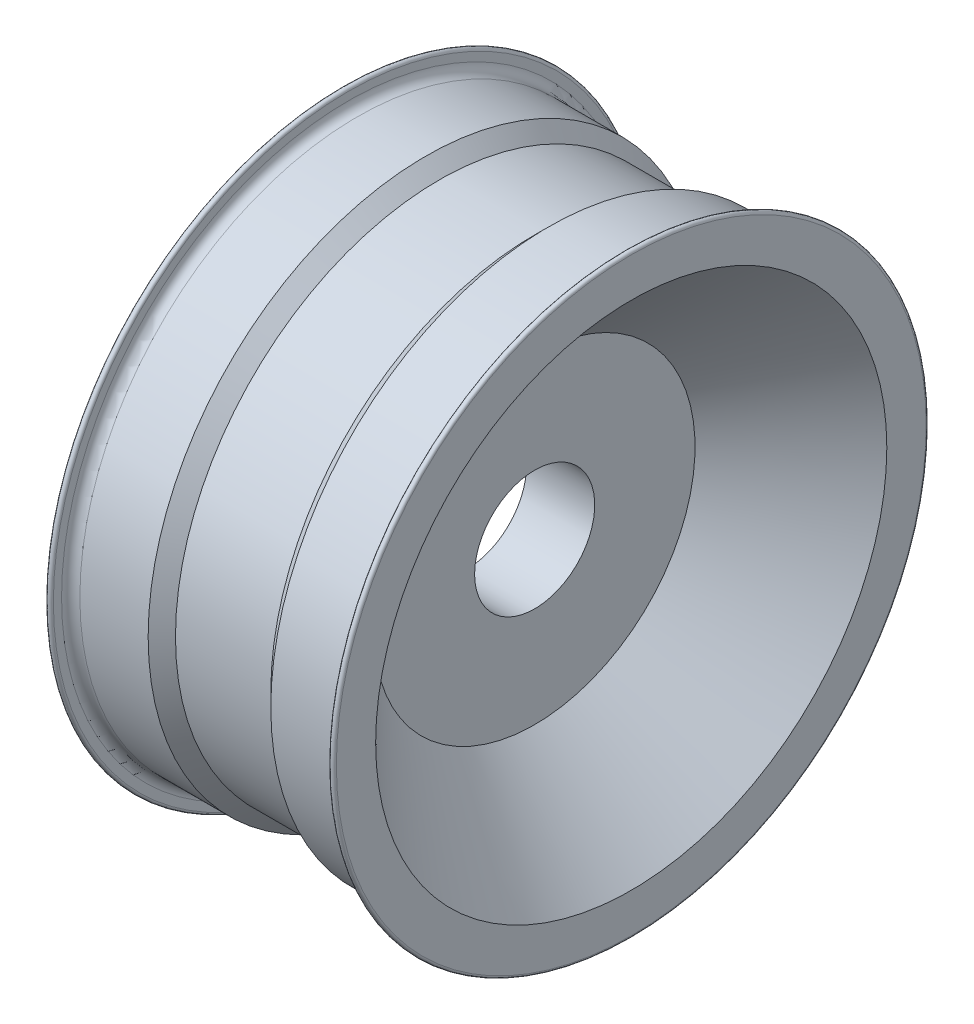
ISO-10303-21;
HEADER;
FILE_DESCRIPTION(('STEP AP214'),'2;1');
FILE_NAME('part.step','',(''),(''),'','','');
FILE_SCHEMA(('AUTOMOTIVE_DESIGN { 1 0 10303 214 1 1 1 1 }'));
ENDSEC;
DATA;
#1=APPLICATION_CONTEXT('core data for automotive mechanical design processes');
#2=APPLICATION_PROTOCOL_DEFINITION('international standard','automotive_design',2000,#1);
#3=PRODUCT_CONTEXT('',#1,'mechanical');
#4=PRODUCT('Part','Part','',(#3));
#5=PRODUCT_RELATED_PRODUCT_CATEGORY('part','',(#4));
#6=PRODUCT_DEFINITION_FORMATION('','',#4);
#7=PRODUCT_DEFINITION_CONTEXT('part definition',#1,'design');
#8=PRODUCT_DEFINITION('design','',#6,#7);
#9=PRODUCT_DEFINITION_SHAPE('','',#8);
#10=(LENGTH_UNIT() NAMED_UNIT(*) SI_UNIT(.MILLI.,.METRE.));
#11=(NAMED_UNIT(*) PLANE_ANGLE_UNIT() SI_UNIT($,.RADIAN.));
#12=(NAMED_UNIT(*) SI_UNIT($,.STERADIAN.) SOLID_ANGLE_UNIT());
#13=UNCERTAINTY_MEASURE_WITH_UNIT(LENGTH_MEASURE(1.E-05),#10,'distance_accuracy_value','');
#14=(GEOMETRIC_REPRESENTATION_CONTEXT(3) GLOBAL_UNCERTAINTY_ASSIGNED_CONTEXT((#13)) GLOBAL_UNIT_ASSIGNED_CONTEXT((#10,
#11,#12)) REPRESENTATION_CONTEXT('',''));
#15=CARTESIAN_POINT('',(0.,0.,0.));
#16=DIRECTION('',(0.,0.,1.));
#17=DIRECTION('',(1.,0.,0.));
#18=AXIS2_PLACEMENT_3D('',#15,#16,#17);
#19=CARTESIAN_POINT('',(0.,0.,0.));
#20=DIRECTION('',(-1.,0.,0.));
#21=DIRECTION('',(0.,0.,1.));
#22=AXIS2_PLACEMENT_3D('',#19,#20,#21);
#23=CYLINDRICAL_SURFACE('',#22,203.2);
#24=CARTESIAN_POINT('',(-94.9,0.,0.));
#25=DIRECTION('',(-1.,0.,0.));
#26=DIRECTION('',(0.,0.,1.));
#27=AXIS2_PLACEMENT_3D('',#24,#25,#26);
#28=CIRCLE('',#27,203.2);
#29=CARTESIAN_POINT('',(-94.9,0.,203.2));
#30=VERTEX_POINT('',#29);
#31=EDGE_CURVE('E11',#30,#30,#28,.T.);
#32=ORIENTED_EDGE('',*,*,#31,.F.);
#33=EDGE_LOOP('',(#32));
#34=FACE_BOUND('',#33,.T.);
#35=CARTESIAN_POINT('',(-44.9,0.,0.));
#36=DIRECTION('',(-1.,0.,0.));
#37=DIRECTION('',(0.,0.,1.));
#38=AXIS2_PLACEMENT_3D('',#35,#36,#37);
#39=CIRCLE('',#38,203.2);
#40=CARTESIAN_POINT('',(-44.9,0.,203.2));
#41=VERTEX_POINT('',#40);
#42=EDGE_CURVE('E91',#41,#41,#39,.T.);
#43=ORIENTED_EDGE('',*,*,#42,.T.);
#44=EDGE_LOOP('',(#43));
#45=FACE_BOUND('',#44,.T.);
#46=ADVANCED_FACE('F39',(#34,#45),#23,.T.);
#47=CARTESIAN_POINT('',(-94.9,0.,0.));
#48=DIRECTION('',(-1.,0.,0.));
#49=DIRECTION('',(0.,0.,1.));
#50=AXIS2_PLACEMENT_3D('',#47,#48,#49);
#51=TOROIDAL_SURFACE('',#50,209.9,6.7);
#52=CARTESIAN_POINT('',(-101.6,0.,0.));
#53=DIRECTION('',(-1.,0.,0.));
#54=DIRECTION('',(0.,0.,1.));
#55=AXIS2_PLACEMENT_3D('',#52,#53,#54);
#56=CIRCLE('',#55,209.9);
#57=CARTESIAN_POINT('',(-101.6,0.,209.9));
#58=VERTEX_POINT('',#57);
#59=EDGE_CURVE('E46',#58,#58,#56,.T.);
#60=ORIENTED_EDGE('',*,*,#59,.F.);
#61=EDGE_LOOP('',(#60));
#62=FACE_BOUND('',#61,.T.);
#63=ORIENTED_EDGE('',*,*,#31,.T.);
#64=EDGE_LOOP('',(#63));
#65=FACE_BOUND('',#64,.T.);
#66=ADVANCED_FACE('F122',(#62,#65),#51,.F.);
#67=CARTESIAN_POINT('',(-101.6,0.,0.));
#68=DIRECTION('',(-1.,0.,0.));
#69=DIRECTION('',(0.,0.,1.));
#70=AXIS2_PLACEMENT_3D('',#67,#68,#69);
#71=PLANE('',#70);
#72=CARTESIAN_POINT('',(-101.6,0.,0.));
#73=DIRECTION('',(-1.,0.,0.));
#74=DIRECTION('',(0.,0.,1.));
#75=AXIS2_PLACEMENT_3D('',#72,#73,#74);
#76=CIRCLE('',#75,215.9);
#77=CARTESIAN_POINT('',(-101.6,0.,215.9));
#78=VERTEX_POINT('',#77);
#79=EDGE_CURVE('E50',#78,#78,#76,.T.);
#80=ORIENTED_EDGE('',*,*,#79,.F.);
#81=EDGE_LOOP('',(#80));
#82=FACE_BOUND('',#81,.T.);
#83=ORIENTED_EDGE('',*,*,#59,.T.);
#84=EDGE_LOOP('',(#83));
#85=FACE_BOUND('',#84,.T.);
#86=ADVANCED_FACE('F127',(#82,#85),#71,.F.);
#87=CARTESIAN_POINT('',(-103.6,0.,0.));
#88=DIRECTION('',(-1.,0.,0.));
#89=DIRECTION('',(0.,0.,1.));
#90=AXIS2_PLACEMENT_3D('',#87,#88,#89);
#91=TOROIDAL_SURFACE('',#90,215.9,1.99999999999999);
#92=ORIENTED_EDGE('',*,*,#79,.T.);
#93=EDGE_LOOP('',(#92));
#94=FACE_BOUND('',#93,.T.);
#95=CARTESIAN_POINT('',(-105.6,0.,0.));
#96=DIRECTION('',(-1.,0.,0.));
#97=DIRECTION('',(0.,0.,1.));
#98=AXIS2_PLACEMENT_3D('',#95,#96,#97);
#99=CIRCLE('',#98,215.9);
#100=CARTESIAN_POINT('',(-105.6,0.,215.9));
#101=VERTEX_POINT('',#100);
#102=EDGE_CURVE('E55',#101,#101,#99,.T.);
#103=ORIENTED_EDGE('',*,*,#102,.F.);
#104=EDGE_LOOP('',(#103));
#105=FACE_BOUND('',#104,.T.);
#106=ADVANCED_FACE('F198',(#94,#105),#91,.T.);
#107=CARTESIAN_POINT('',(-105.6,0.,0.));
#108=DIRECTION('',(-1.,0.,0.));
#109=DIRECTION('',(0.,0.,1.));
#110=AXIS2_PLACEMENT_3D('',#107,#108,#109);
#111=PLANE('',#110);
#112=ORIENTED_EDGE('',*,*,#102,.T.);
#113=EDGE_LOOP('',(#112));
#114=FACE_BOUND('',#113,.T.);
#115=CARTESIAN_POINT('',(-105.6,0.,0.));
#116=DIRECTION('',(-1.,0.,0.));
#117=DIRECTION('',(0.,0.,1.));
#118=AXIS2_PLACEMENT_3D('',#115,#116,#117);
#119=CIRCLE('',#118,188.494969012571);
#120=CARTESIAN_POINT('',(-105.6,0.,188.494969012571));
#121=VERTEX_POINT('',#120);
#122=EDGE_CURVE('E58',#121,#121,#119,.T.);
#123=ORIENTED_EDGE('',*,*,#122,.F.);
#124=EDGE_LOOP('',(#123));
#125=FACE_BOUND('',#124,.T.);
#126=ADVANCED_FACE('F194',(#114,#125),#111,.T.);
#127=CARTESIAN_POINT('',(0.,0.,0.));
#128=DIRECTION('',(-1.,0.,0.));
#129=DIRECTION('',(0.,0.,1.));
#130=AXIS2_PLACEMENT_3D('',#127,#128,#129);
#131=CONICAL_SURFACE('',#130,117.431960932421,0.59233666114381);
#132=ORIENTED_EDGE('',*,*,#122,.T.);
#133=EDGE_LOOP('',(#132));
#134=FACE_BOUND('',#133,.T.);
#135=CARTESIAN_POINT('',(0.,0.,0.));
#136=DIRECTION('',(-1.,0.,0.));
#137=DIRECTION('',(0.,0.,1.));
#138=AXIS2_PLACEMENT_3D('',#135,#136,#137);
#139=CIRCLE('',#138,117.431960932421);
#140=CARTESIAN_POINT('',(0.,0.,117.431960932421));
#141=VERTEX_POINT('',#140);
#142=EDGE_CURVE('E61',#141,#141,#139,.T.);
#143=ORIENTED_EDGE('',*,*,#142,.F.);
#144=EDGE_LOOP('',(#143));
#145=FACE_BOUND('',#144,.T.);
#146=ADVANCED_FACE('F190',(#134,#145),#131,.F.);
#147=CARTESIAN_POINT('',(0.,0.,0.));
#148=DIRECTION('',(-1.,0.,0.));
#149=DIRECTION('',(0.,0.,1.));
#150=AXIS2_PLACEMENT_3D('',#147,#148,#149);
#151=PLANE('',#150);
#152=CARTESIAN_POINT('',(0.,0.,0.));
#153=DIRECTION('',(-1.,0.,0.));
#154=DIRECTION('',(0.,0.,1.));
#155=AXIS2_PLACEMENT_3D('',#152,#153,#154);
#156=CIRCLE('',#155,60.);
#157=CARTESIAN_POINT('',(0.,0.,60.));
#158=VERTEX_POINT('',#157);
#159=EDGE_CURVE('E95',#158,#158,#156,.T.);
#160=ORIENTED_EDGE('',*,*,#159,.F.);
#161=EDGE_LOOP('',(#160));
#162=FACE_BOUND('',#161,.T.);
#163=ORIENTED_EDGE('',*,*,#142,.T.);
#164=EDGE_LOOP('',(#163));
#165=FACE_BOUND('',#164,.T.);
#166=ADVANCED_FACE('F187',(#162,#165),#151,.T.);
#167=CARTESIAN_POINT('',(34.9,0.,0.));
#168=DIRECTION('',(-1.,0.,0.));
#169=DIRECTION('',(0.,0.,1.));
#170=AXIS2_PLACEMENT_3D('',#167,#168,#169);
#171=PLANE('',#170);
#172=CARTESIAN_POINT('',(34.9,0.,0.));
#173=DIRECTION('',(-1.,0.,0.));
#174=DIRECTION('',(0.,0.,1.));
#175=AXIS2_PLACEMENT_3D('',#172,#173,#174);
#176=CIRCLE('',#175,43.9792616711066);
#177=CARTESIAN_POINT('',(34.9,0.,43.9792616711066));
#178=VERTEX_POINT('',#177);
#179=EDGE_CURVE('E42',#178,#178,#176,.T.);
#180=ORIENTED_EDGE('',*,*,#179,.T.);
#181=EDGE_LOOP('',(#180));
#182=FACE_BOUND('',#181,.T.);
#183=CARTESIAN_POINT('',(34.9,0.,0.));
#184=DIRECTION('',(-1.,0.,0.));
#185=DIRECTION('',(0.,0.,1.));
#186=AXIS2_PLACEMENT_3D('',#183,#184,#185);
#187=CIRCLE('',#186,117.431960932421);
#188=CARTESIAN_POINT('',(34.9,0.,117.431960932421));
#189=VERTEX_POINT('',#188);
#190=EDGE_CURVE('E64',#189,#189,#187,.T.);
#191=ORIENTED_EDGE('',*,*,#190,.F.);
#192=EDGE_LOOP('',(#191));
#193=FACE_BOUND('',#192,.T.);
#194=ADVANCED_FACE('F107',(#182,#193),#171,.F.);
#195=CARTESIAN_POINT('',(34.9,0.,0.));
#196=DIRECTION('',(1.,0.,0.));
#197=DIRECTION('',(0.,0.,-1.));
#198=AXIS2_PLACEMENT_3D('',#195,#196,#197);
#199=CONICAL_SURFACE('',#198,117.431960932421,0.778280086177294);
#200=CARTESIAN_POINT('',(105.6,0.,0.));
#201=DIRECTION('',(-1.,0.,0.));
#202=DIRECTION('',(0.,0.,1.));
#203=AXIS2_PLACEMENT_3D('',#200,#201,#202);
#204=CIRCLE('',#203,187.132561735233);
#205=CARTESIAN_POINT('',(105.6,0.,187.132561735233));
#206=VERTEX_POINT('',#205);
#207=EDGE_CURVE('E67',#206,#206,#204,.T.);
#208=ORIENTED_EDGE('',*,*,#207,.F.);
#209=EDGE_LOOP('',(#208));
#210=FACE_BOUND('',#209,.T.);
#211=ORIENTED_EDGE('',*,*,#190,.T.);
#212=EDGE_LOOP('',(#211));
#213=FACE_BOUND('',#212,.T.);
#214=ADVANCED_FACE('F176',(#210,#213),#199,.F.);
#215=CARTESIAN_POINT('',(105.6,0.,0.));
#216=DIRECTION('',(1.,0.,0.));
#217=DIRECTION('',(0.,0.,-1.));
#218=AXIS2_PLACEMENT_3D('',#215,#216,#217);
#219=PLANE('',#218);
#220=ORIENTED_EDGE('',*,*,#207,.T.);
#221=EDGE_LOOP('',(#220));
#222=FACE_BOUND('',#221,.T.);
#223=CARTESIAN_POINT('',(105.6,0.,0.));
#224=DIRECTION('',(-1.,0.,0.));
#225=DIRECTION('',(0.,0.,1.));
#226=AXIS2_PLACEMENT_3D('',#223,#224,#225);
#227=CIRCLE('',#226,215.9);
#228=CARTESIAN_POINT('',(105.6,0.,215.9));
#229=VERTEX_POINT('',#228);
#230=EDGE_CURVE('E70',#229,#229,#227,.T.);
#231=ORIENTED_EDGE('',*,*,#230,.F.);
#232=EDGE_LOOP('',(#231));
#233=FACE_BOUND('',#232,.T.);
#234=ADVANCED_FACE('F171',(#222,#233),#219,.T.);
#235=CARTESIAN_POINT('',(103.6,0.,0.));
#236=DIRECTION('',(-1.,0.,0.));
#237=DIRECTION('',(0.,0.,1.));
#238=AXIS2_PLACEMENT_3D('',#235,#236,#237);
#239=TOROIDAL_SURFACE('',#238,215.9,1.99999999999999);
#240=CARTESIAN_POINT('',(101.6,0.,0.));
#241=DIRECTION('',(-1.,0.,0.));
#242=DIRECTION('',(0.,0.,1.));
#243=AXIS2_PLACEMENT_3D('',#240,#241,#242);
#244=CIRCLE('',#243,215.9);
#245=CARTESIAN_POINT('',(101.6,0.,215.9));
#246=VERTEX_POINT('',#245);
#247=EDGE_CURVE('E73',#246,#246,#244,.T.);
#248=ORIENTED_EDGE('',*,*,#247,.F.);
#249=EDGE_LOOP('',(#248));
#250=FACE_BOUND('',#249,.T.);
#251=ORIENTED_EDGE('',*,*,#230,.T.);
#252=EDGE_LOOP('',(#251));
#253=FACE_BOUND('',#252,.T.);
#254=ADVANCED_FACE('F165',(#250,#253),#239,.T.);
#255=CARTESIAN_POINT('',(101.6,-2.3499720687899E-13,0.));
#256=DIRECTION('',(1.,0.,0.));
#257=DIRECTION('',(0.,0.,-1.));
#258=AXIS2_PLACEMENT_3D('',#255,#256,#257);
#259=PLANE('',#258);
#260=CARTESIAN_POINT('',(101.6,0.,0.));
#261=DIRECTION('',(-1.,0.,0.));
#262=DIRECTION('',(0.,0.,1.));
#263=AXIS2_PLACEMENT_3D('',#260,#261,#262);
#264=CIRCLE('',#263,209.9);
#265=CARTESIAN_POINT('',(101.6,0.,209.9));
#266=VERTEX_POINT('',#265);
#267=EDGE_CURVE('E76',#266,#266,#264,.T.);
#268=ORIENTED_EDGE('',*,*,#267,.F.);
#269=EDGE_LOOP('',(#268));
#270=FACE_BOUND('',#269,.T.);
#271=ORIENTED_EDGE('',*,*,#247,.T.);
#272=EDGE_LOOP('',(#271));
#273=FACE_BOUND('',#272,.T.);
#274=ADVANCED_FACE('F159',(#270,#273),#259,.F.);
#275=CARTESIAN_POINT('',(94.9,0.,0.));
#276=DIRECTION('',(-1.,0.,0.));
#277=DIRECTION('',(0.,0.,1.));
#278=AXIS2_PLACEMENT_3D('',#275,#276,#277);
#279=TOROIDAL_SURFACE('',#278,209.9,6.7);
#280=CARTESIAN_POINT('',(94.9,0.,0.));
#281=DIRECTION('',(-1.,0.,0.));
#282=DIRECTION('',(0.,0.,1.));
#283=AXIS2_PLACEMENT_3D('',#280,#281,#282);
#284=CIRCLE('',#283,203.2);
#285=CARTESIAN_POINT('',(94.9,0.,203.2));
#286=VERTEX_POINT('',#285);
#287=EDGE_CURVE('E79',#286,#286,#284,.T.);
#288=ORIENTED_EDGE('',*,*,#287,.F.);
#289=EDGE_LOOP('',(#288));
#290=FACE_BOUND('',#289,.T.);
#291=ORIENTED_EDGE('',*,*,#267,.T.);
#292=EDGE_LOOP('',(#291));
#293=FACE_BOUND('',#292,.T.);
#294=ADVANCED_FACE('F153',(#290,#293),#279,.F.);
#295=CARTESIAN_POINT('',(0.,0.,0.));
#296=DIRECTION('',(-1.,0.,0.));
#297=DIRECTION('',(0.,0.,1.));
#298=AXIS2_PLACEMENT_3D('',#295,#296,#297);
#299=CYLINDRICAL_SURFACE('',#298,203.2);
#300=CARTESIAN_POINT('',(44.9,0.,0.));
#301=DIRECTION('',(-1.,0.,0.));
#302=DIRECTION('',(0.,0.,1.));
#303=AXIS2_PLACEMENT_3D('',#300,#301,#302);
#304=CIRCLE('',#303,203.2);
#305=CARTESIAN_POINT('',(44.9,0.,203.2));
#306=VERTEX_POINT('',#305);
#307=EDGE_CURVE('E82',#306,#306,#304,.T.);
#308=ORIENTED_EDGE('',*,*,#307,.F.);
#309=EDGE_LOOP('',(#308));
#310=FACE_BOUND('',#309,.T.);
#311=ORIENTED_EDGE('',*,*,#287,.T.);
#312=EDGE_LOOP('',(#311));
#313=FACE_BOUND('',#312,.T.);
#314=ADVANCED_FACE('F147',(#310,#313),#299,.T.);
#315=CARTESIAN_POINT('',(44.9,0.,0.));
#316=DIRECTION('',(1.,0.,0.));
#317=DIRECTION('',(0.,0.,-1.));
#318=AXIS2_PLACEMENT_3D('',#315,#316,#317);
#319=CONICAL_SURFACE('',#318,203.2,0.785398163397449);
#320=CARTESIAN_POINT('',(34.9,0.,0.));
#321=DIRECTION('',(-1.,0.,0.));
#322=DIRECTION('',(0.,0.,1.));
#323=AXIS2_PLACEMENT_3D('',#320,#321,#322);
#324=CIRCLE('',#323,193.2);
#325=CARTESIAN_POINT('',(34.9,0.,193.2));
#326=VERTEX_POINT('',#325);
#327=EDGE_CURVE('E85',#326,#326,#324,.T.);
#328=ORIENTED_EDGE('',*,*,#327,.F.);
#329=EDGE_LOOP('',(#328));
#330=FACE_BOUND('',#329,.T.);
#331=ORIENTED_EDGE('',*,*,#307,.T.);
#332=EDGE_LOOP('',(#331));
#333=FACE_BOUND('',#332,.T.);
#334=ADVANCED_FACE('F141',(#330,#333),#319,.T.);
#335=CARTESIAN_POINT('',(0.,0.,0.));
#336=DIRECTION('',(-1.,0.,0.));
#337=DIRECTION('',(0.,0.,1.));
#338=AXIS2_PLACEMENT_3D('',#335,#336,#337);
#339=CYLINDRICAL_SURFACE('',#338,193.2);
#340=CARTESIAN_POINT('',(-34.9,0.,0.));
#341=DIRECTION('',(-1.,0.,0.));
#342=DIRECTION('',(0.,0.,1.));
#343=AXIS2_PLACEMENT_3D('',#340,#341,#342);
#344=CIRCLE('',#343,193.2);
#345=CARTESIAN_POINT('',(-34.9,0.,193.2));
#346=VERTEX_POINT('',#345);
#347=EDGE_CURVE('E88',#346,#346,#344,.T.);
#348=ORIENTED_EDGE('',*,*,#347,.F.);
#349=EDGE_LOOP('',(#348));
#350=FACE_BOUND('',#349,.T.);
#351=ORIENTED_EDGE('',*,*,#327,.T.);
#352=EDGE_LOOP('',(#351));
#353=FACE_BOUND('',#352,.T.);
#354=ADVANCED_FACE('F135',(#350,#353),#339,.T.);
#355=CARTESIAN_POINT('',(-34.9,0.,0.));
#356=DIRECTION('',(-1.,0.,0.));
#357=DIRECTION('',(0.,0.,1.));
#358=AXIS2_PLACEMENT_3D('',#355,#356,#357);
#359=CONICAL_SURFACE('',#358,193.2,0.785398163397448);
#360=ORIENTED_EDGE('',*,*,#42,.F.);
#361=EDGE_LOOP('',(#360));
#362=FACE_BOUND('',#361,.T.);
#363=ORIENTED_EDGE('',*,*,#347,.T.);
#364=EDGE_LOOP('',(#363));
#365=FACE_BOUND('',#364,.T.);
#366=ADVANCED_FACE('F132',(#362,#365),#359,.T.);
#367=CARTESIAN_POINT('',(-15.,0.,0.));
#368=DIRECTION('',(-1.,0.,0.));
#369=DIRECTION('',(0.,0.,1.));
#370=AXIS2_PLACEMENT_3D('',#367,#368,#369);
#371=PLANE('',#370);
#372=CARTESIAN_POINT('',(-15.,0.,0.));
#373=DIRECTION('',(-1.,0.,0.));
#374=DIRECTION('',(0.,0.,1.));
#375=AXIS2_PLACEMENT_3D('',#372,#373,#374);
#376=CIRCLE('',#375,60.);
#377=CARTESIAN_POINT('',(-15.,0.,60.));
#378=VERTEX_POINT('',#377);
#379=EDGE_CURVE('E94',#378,#378,#376,.T.);
#380=ORIENTED_EDGE('',*,*,#379,.T.);
#381=EDGE_LOOP('',(#380));
#382=FACE_BOUND('',#381,.T.);
#383=CARTESIAN_POINT('',(-15.,0.,0.));
#384=DIRECTION('',(-1.,0.,0.));
#385=DIRECTION('',(0.,0.,1.));
#386=AXIS2_PLACEMENT_3D('',#383,#384,#385);
#387=CIRCLE('',#386,43.9792616711066);
#388=CARTESIAN_POINT('',(-15.,0.,43.9792616711066));
#389=VERTEX_POINT('',#388);
#390=EDGE_CURVE('E98',#389,#389,#387,.T.);
#391=ORIENTED_EDGE('',*,*,#390,.F.);
#392=EDGE_LOOP('',(#391));
#393=FACE_BOUND('',#392,.T.);
#394=ADVANCED_FACE('F117',(#382,#393),#371,.T.);
#395=CARTESIAN_POINT('',(-15.,0.,0.));
#396=DIRECTION('',(1.,0.,0.));
#397=DIRECTION('',(0.,0.,-1.));
#398=AXIS2_PLACEMENT_3D('',#395,#396,#397);
#399=CYLINDRICAL_SURFACE('',#398,60.);
#400=ORIENTED_EDGE('',*,*,#379,.F.);
#401=EDGE_LOOP('',(#400));
#402=FACE_BOUND('',#401,.T.);
#403=ORIENTED_EDGE('',*,*,#159,.T.);
#404=EDGE_LOOP('',(#403));
#405=FACE_BOUND('',#404,.T.);
#406=ADVANCED_FACE('F112',(#402,#405),#399,.T.);
#407=CARTESIAN_POINT('',(-15.,0.,0.));
#408=DIRECTION('',(1.,0.,0.));
#409=DIRECTION('',(0.,0.,-1.));
#410=AXIS2_PLACEMENT_3D('',#407,#408,#409);
#411=CYLINDRICAL_SURFACE('',#410,43.9792616711066);
#412=ORIENTED_EDGE('',*,*,#390,.T.);
#413=EDGE_LOOP('',(#412));
#414=FACE_BOUND('',#413,.T.);
#415=ORIENTED_EDGE('',*,*,#179,.F.);
#416=EDGE_LOOP('',(#415));
#417=FACE_BOUND('',#416,.T.);
#418=ADVANCED_FACE('F110',(#414,#417),#411,.F.);
#419=CLOSED_SHELL('',(#46,#66,#86,#106,#126,#146,#166,#194,#214,#234,#254,#274,#294,#314,#334,
#354,#366,#394,#406,#418));
#420=MANIFOLD_SOLID_BREP('B2',#419);
#421=ADVANCED_BREP_SHAPE_REPRESENTATION('',(#18,#420),#14);
#422=SHAPE_DEFINITION_REPRESENTATION(#9,#421);
ENDSEC;
END-ISO-10303-21;
